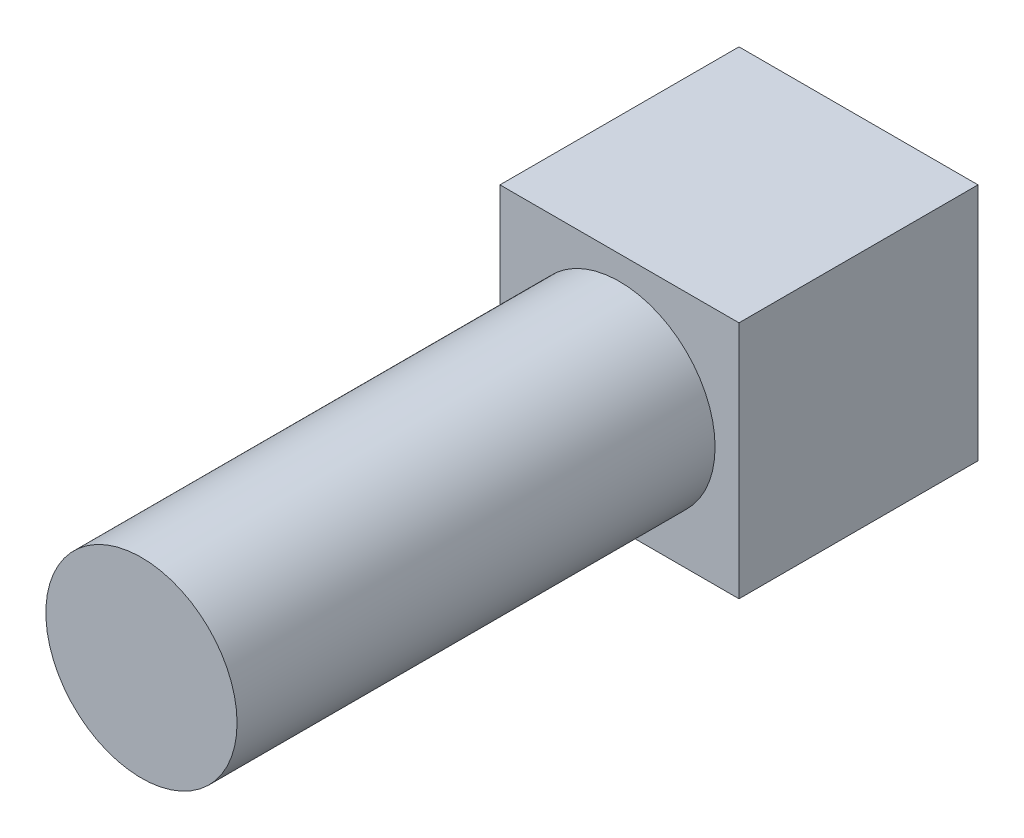
ISO-10303-21;
HEADER;
FILE_DESCRIPTION(('STEP AP214'),'2;1');
FILE_NAME('part.step','',(''),(''),'','','');
FILE_SCHEMA(('AUTOMOTIVE_DESIGN { 1 0 10303 214 1 1 1 1 }'));
ENDSEC;
DATA;
#1=APPLICATION_CONTEXT('core data for automotive mechanical design processes');
#2=APPLICATION_PROTOCOL_DEFINITION('international standard','automotive_design',2000,#1);
#3=PRODUCT_CONTEXT('',#1,'mechanical');
#4=PRODUCT('Part','Part','',(#3));
#5=PRODUCT_RELATED_PRODUCT_CATEGORY('part','',(#4));
#6=PRODUCT_DEFINITION_FORMATION('','',#4);
#7=PRODUCT_DEFINITION_CONTEXT('part definition',#1,'design');
#8=PRODUCT_DEFINITION('design','',#6,#7);
#9=PRODUCT_DEFINITION_SHAPE('','',#8);
#10=(LENGTH_UNIT() NAMED_UNIT(*) SI_UNIT(.MILLI.,.METRE.));
#11=(NAMED_UNIT(*) PLANE_ANGLE_UNIT() SI_UNIT($,.RADIAN.));
#12=(NAMED_UNIT(*) SI_UNIT($,.STERADIAN.) SOLID_ANGLE_UNIT());
#13=UNCERTAINTY_MEASURE_WITH_UNIT(LENGTH_MEASURE(1.E-05),#10,'distance_accuracy_value','');
#14=(GEOMETRIC_REPRESENTATION_CONTEXT(3) GLOBAL_UNCERTAINTY_ASSIGNED_CONTEXT((#13)) GLOBAL_UNIT_ASSIGNED_CONTEXT((#10,
#11,#12)) REPRESENTATION_CONTEXT('',''));
#15=CARTESIAN_POINT('',(0.,0.,0.));
#16=DIRECTION('',(0.,0.,1.));
#17=DIRECTION('',(1.,0.,0.));
#18=AXIS2_PLACEMENT_3D('',#15,#16,#17);
#19=CARTESIAN_POINT('',(5.00000000000001,10.,-4.99999999999998));
#20=DIRECTION('',(-1.,0.,0.));
#21=DIRECTION('',(0.,0.,1.));
#22=AXIS2_PLACEMENT_3D('',#19,#20,#21);
#23=PLANE('',#22);
#24=DIRECTION('',(0.,0.,-1.));
#25=VECTOR('',#24,1.);
#26=CARTESIAN_POINT('',(5.00000000000001,0.,-4.99999999999998));
#27=LINE('',#26,#25);
#28=CARTESIAN_POINT('',(5.00000000000001,0.,5.00000000000003));
#29=VERTEX_POINT('',#28);
#30=CARTESIAN_POINT('',(5.00000000000001,0.,-4.99999999999998));
#31=VERTEX_POINT('',#30);
#32=EDGE_CURVE('E110',#29,#31,#27,.T.);
#33=ORIENTED_EDGE('',*,*,#32,.T.);
#34=DIRECTION('',(0.,-1.,0.));
#35=VECTOR('',#34,1.);
#36=CARTESIAN_POINT('',(5.00000000000001,10.,-4.99999999999998));
#37=LINE('',#36,#35);
#38=CARTESIAN_POINT('',(5.00000000000001,10.,-4.99999999999998));
#39=VERTEX_POINT('',#38);
#40=EDGE_CURVE('E42',#39,#31,#37,.T.);
#41=ORIENTED_EDGE('',*,*,#40,.F.);
#42=DIRECTION('',(0.,0.,-1.));
#43=VECTOR('',#42,1.);
#44=CARTESIAN_POINT('',(5.00000000000001,10.,-4.99999999999998));
#45=LINE('',#44,#43);
#46=CARTESIAN_POINT('',(5.00000000000001,10.,5.00000000000003));
#47=VERTEX_POINT('',#46);
#48=EDGE_CURVE('E93',#47,#39,#45,.T.);
#49=ORIENTED_EDGE('',*,*,#48,.F.);
#50=DIRECTION('',(0.,-1.,0.));
#51=VECTOR('',#50,1.);
#52=CARTESIAN_POINT('',(5.00000000000001,10.,5.00000000000003));
#53=LINE('',#52,#51);
#54=EDGE_CURVE('E106',#47,#29,#53,.T.);
#55=ORIENTED_EDGE('',*,*,#54,.T.);
#56=EDGE_LOOP('',(#33,#41,#49,#55));
#57=FACE_BOUND('',#56,.T.);
#58=ADVANCED_FACE('F39',(#57),#23,.F.);
#59=CARTESIAN_POINT('',(-4.99999999999999,10.,-4.99999999999998));
#60=DIRECTION('',(0.,0.,1.));
#61=DIRECTION('',(1.,0.,0.));
#62=AXIS2_PLACEMENT_3D('',#59,#60,#61);
#63=PLANE('',#62);
#64=DIRECTION('',(-1.,0.,0.));
#65=VECTOR('',#64,1.);
#66=CARTESIAN_POINT('',(-4.99999999999999,0.,-4.99999999999998));
#67=LINE('',#66,#65);
#68=CARTESIAN_POINT('',(-4.99999999999999,0.,-4.99999999999998));
#69=VERTEX_POINT('',#68);
#70=EDGE_CURVE('E99',#31,#69,#67,.T.);
#71=ORIENTED_EDGE('',*,*,#70,.T.);
#72=DIRECTION('',(0.,-1.,0.));
#73=VECTOR('',#72,1.);
#74=CARTESIAN_POINT('',(-4.99999999999999,10.,-4.99999999999998));
#75=LINE('',#74,#73);
#76=CARTESIAN_POINT('',(-4.99999999999999,10.,-4.99999999999998));
#77=VERTEX_POINT('',#76);
#78=EDGE_CURVE('E97',#77,#69,#75,.T.);
#79=ORIENTED_EDGE('',*,*,#78,.F.);
#80=DIRECTION('',(-1.,0.,0.));
#81=VECTOR('',#80,1.);
#82=CARTESIAN_POINT('',(-4.99999999999999,10.,-4.99999999999998));
#83=LINE('',#82,#81);
#84=EDGE_CURVE('E88',#39,#77,#83,.T.);
#85=ORIENTED_EDGE('',*,*,#84,.F.);
#86=ORIENTED_EDGE('',*,*,#40,.T.);
#87=EDGE_LOOP('',(#71,#79,#85,#86));
#88=FACE_BOUND('',#87,.T.);
#89=ADVANCED_FACE('F98',(#88),#63,.F.);
#90=CARTESIAN_POINT('',(-4.99999999999999,10.,-4.99999999999998));
#91=DIRECTION('',(1.,0.,0.));
#92=DIRECTION('',(0.,0.,-1.));
#93=AXIS2_PLACEMENT_3D('',#90,#91,#92);
#94=PLANE('',#93);
#95=DIRECTION('',(0.,0.,1.));
#96=VECTOR('',#95,1.);
#97=CARTESIAN_POINT('',(-4.99999999999999,0.,-4.99999999999998));
#98=LINE('',#97,#96);
#99=CARTESIAN_POINT('',(-4.99999999999999,0.,5.00000000000003));
#100=VERTEX_POINT('',#99);
#101=EDGE_CURVE('E74',#69,#100,#98,.T.);
#102=ORIENTED_EDGE('',*,*,#101,.T.);
#103=DIRECTION('',(0.,-1.,0.));
#104=VECTOR('',#103,1.);
#105=CARTESIAN_POINT('',(-4.99999999999999,10.,5.00000000000003));
#106=LINE('',#105,#104);
#107=CARTESIAN_POINT('',(-4.99999999999999,10.,5.00000000000003));
#108=VERTEX_POINT('',#107);
#109=EDGE_CURVE('E101',#108,#100,#106,.T.);
#110=ORIENTED_EDGE('',*,*,#109,.F.);
#111=DIRECTION('',(0.,0.,1.));
#112=VECTOR('',#111,1.);
#113=CARTESIAN_POINT('',(-4.99999999999999,10.,-4.99999999999998));
#114=LINE('',#113,#112);
#115=EDGE_CURVE('E91',#77,#108,#114,.T.);
#116=ORIENTED_EDGE('',*,*,#115,.F.);
#117=ORIENTED_EDGE('',*,*,#78,.T.);
#118=EDGE_LOOP('',(#102,#110,#116,#117));
#119=FACE_BOUND('',#118,.T.);
#120=ADVANCED_FACE('F102',(#119),#94,.F.);
#121=CARTESIAN_POINT('',(-4.99999999999999,10.,5.00000000000003));
#122=DIRECTION('',(0.,0.,-1.));
#123=DIRECTION('',(-1.,0.,0.));
#124=AXIS2_PLACEMENT_3D('',#121,#122,#123);
#125=PLANE('',#124);
#126=CARTESIAN_POINT('',(0.,5.,5.00000000000003));
#127=DIRECTION('',(0.,0.,1.));
#128=DIRECTION('',(1.,0.,0.));
#129=AXIS2_PLACEMENT_3D('',#126,#127,#128);
#130=CIRCLE('',#129,4.);
#131=CARTESIAN_POINT('',(4.,5.,5.00000000000003));
#132=VERTEX_POINT('',#131);
#133=EDGE_CURVE('E11',#132,#132,#130,.T.);
#134=ORIENTED_EDGE('',*,*,#133,.F.);
#135=EDGE_LOOP('',(#134));
#136=FACE_BOUND('',#135,.T.);
#137=DIRECTION('',(1.,0.,0.));
#138=VECTOR('',#137,1.);
#139=CARTESIAN_POINT('',(-4.99999999999999,0.,5.00000000000003));
#140=LINE('',#139,#138);
#141=EDGE_CURVE('E80',#100,#29,#140,.T.);
#142=ORIENTED_EDGE('',*,*,#141,.T.);
#143=ORIENTED_EDGE('',*,*,#54,.F.);
#144=DIRECTION('',(1.,0.,0.));
#145=VECTOR('',#144,1.);
#146=CARTESIAN_POINT('',(-4.99999999999999,10.,5.00000000000003));
#147=LINE('',#146,#145);
#148=EDGE_CURVE('E57',#108,#47,#147,.T.);
#149=ORIENTED_EDGE('',*,*,#148,.F.);
#150=ORIENTED_EDGE('',*,*,#109,.T.);
#151=EDGE_LOOP('',(#142,#143,#149,#150));
#152=FACE_BOUND('',#151,.T.);
#153=ADVANCED_FACE('F124',(#136,#152),#125,.F.);
#154=CARTESIAN_POINT('',(0.,10.,0.));
#155=DIRECTION('',(0.,1.,0.));
#156=DIRECTION('',(0.,0.,1.));
#157=AXIS2_PLACEMENT_3D('',#154,#155,#156);
#158=PLANE('',#157);
#159=ORIENTED_EDGE('',*,*,#48,.T.);
#160=ORIENTED_EDGE('',*,*,#84,.T.);
#161=ORIENTED_EDGE('',*,*,#115,.T.);
#162=ORIENTED_EDGE('',*,*,#148,.T.);
#163=EDGE_LOOP('',(#159,#160,#161,#162));
#164=FACE_BOUND('',#163,.T.);
#165=ADVANCED_FACE('F89',(#164),#158,.T.);
#166=CARTESIAN_POINT('',(0.,0.,0.));
#167=DIRECTION('',(0.,1.,0.));
#168=DIRECTION('',(0.,0.,1.));
#169=AXIS2_PLACEMENT_3D('',#166,#167,#168);
#170=PLANE('',#169);
#171=ORIENTED_EDGE('',*,*,#32,.F.);
#172=ORIENTED_EDGE('',*,*,#141,.F.);
#173=ORIENTED_EDGE('',*,*,#101,.F.);
#174=ORIENTED_EDGE('',*,*,#70,.F.);
#175=EDGE_LOOP('',(#171,#172,#173,#174));
#176=FACE_BOUND('',#175,.T.);
#177=ADVANCED_FACE('F127',(#176),#170,.F.);
#178=CARTESIAN_POINT('',(0.,5.,25.));
#179=DIRECTION('',(0.,0.,-1.));
#180=DIRECTION('',(-1.,0.,0.));
#181=AXIS2_PLACEMENT_3D('',#178,#179,#180);
#182=CYLINDRICAL_SURFACE('',#181,4.);
#183=CARTESIAN_POINT('',(0.,5.,25.));
#184=DIRECTION('',(0.,0.,1.));
#185=DIRECTION('',(1.,0.,0.));
#186=AXIS2_PLACEMENT_3D('',#183,#184,#185);
#187=CIRCLE('',#186,4.);
#188=CARTESIAN_POINT('',(4.,5.,25.));
#189=VERTEX_POINT('',#188);
#190=EDGE_CURVE('E114',#189,#189,#187,.T.);
#191=ORIENTED_EDGE('',*,*,#190,.F.);
#192=EDGE_LOOP('',(#191));
#193=FACE_BOUND('',#192,.T.);
#194=ORIENTED_EDGE('',*,*,#133,.T.);
#195=EDGE_LOOP('',(#194));
#196=FACE_BOUND('',#195,.T.);
#197=ADVANCED_FACE('F137',(#193,#196),#182,.T.);
#198=CARTESIAN_POINT('',(0.,5.,25.));
#199=DIRECTION('',(0.,0.,1.));
#200=DIRECTION('',(1.,0.,0.));
#201=AXIS2_PLACEMENT_3D('',#198,#199,#200);
#202=PLANE('',#201);
#203=ORIENTED_EDGE('',*,*,#190,.T.);
#204=EDGE_LOOP('',(#203));
#205=FACE_BOUND('',#204,.T.);
#206=ADVANCED_FACE('F135',(#205),#202,.T.);
#207=CLOSED_SHELL('',(#58,#89,#120,#153,#165,#177,#197,#206));
#208=MANIFOLD_SOLID_BREP('B2',#207);
#209=ADVANCED_BREP_SHAPE_REPRESENTATION('',(#18,#208),#14);
#210=SHAPE_DEFINITION_REPRESENTATION(#9,#209);
ENDSEC;
END-ISO-10303-21;
